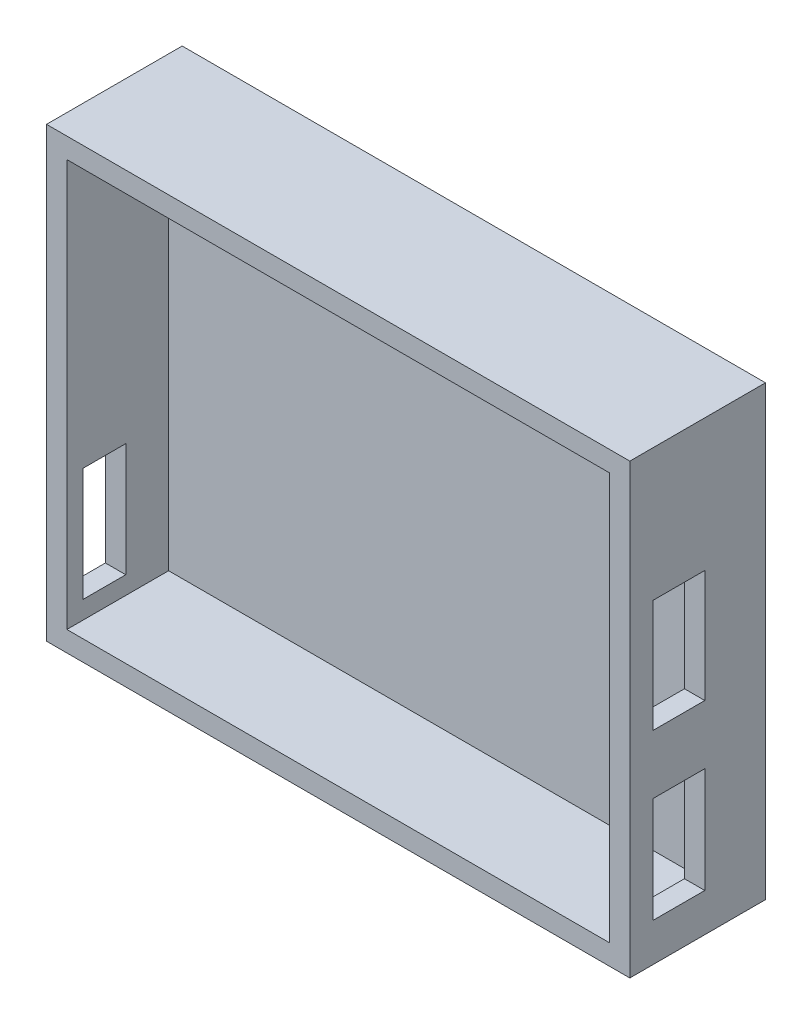
ISO-10303-21;
HEADER;
FILE_DESCRIPTION(('STEP AP214'),'2;1');
FILE_NAME('part.step','',(''),(''),'','','');
FILE_SCHEMA(('AUTOMOTIVE_DESIGN { 1 0 10303 214 1 1 1 1 }'));
ENDSEC;
DATA;
#1=APPLICATION_CONTEXT('core data for automotive mechanical design processes');
#2=APPLICATION_PROTOCOL_DEFINITION('international standard','automotive_design',2000,#1);
#3=PRODUCT_CONTEXT('',#1,'mechanical');
#4=PRODUCT('Part','Part','',(#3));
#5=PRODUCT_RELATED_PRODUCT_CATEGORY('part','',(#4));
#6=PRODUCT_DEFINITION_FORMATION('','',#4);
#7=PRODUCT_DEFINITION_CONTEXT('part definition',#1,'design');
#8=PRODUCT_DEFINITION('design','',#6,#7);
#9=PRODUCT_DEFINITION_SHAPE('','',#8);
#10=(LENGTH_UNIT() NAMED_UNIT(*) SI_UNIT(.MILLI.,.METRE.));
#11=(NAMED_UNIT(*) PLANE_ANGLE_UNIT() SI_UNIT($,.RADIAN.));
#12=(NAMED_UNIT(*) SI_UNIT($,.STERADIAN.) SOLID_ANGLE_UNIT());
#13=UNCERTAINTY_MEASURE_WITH_UNIT(LENGTH_MEASURE(1.E-05),#10,'distance_accuracy_value','');
#14=(GEOMETRIC_REPRESENTATION_CONTEXT(3) GLOBAL_UNCERTAINTY_ASSIGNED_CONTEXT((#13)) GLOBAL_UNIT_ASSIGNED_CONTEXT((#10,
#11,#12)) REPRESENTATION_CONTEXT('',''));
#15=CARTESIAN_POINT('',(0.,0.,0.));
#16=DIRECTION('',(0.,0.,1.));
#17=DIRECTION('',(1.,0.,0.));
#18=AXIS2_PLACEMENT_3D('',#15,#16,#17);
#19=CARTESIAN_POINT('',(-35.8301158301159,27.3359073359073,5.));
#20=DIRECTION('',(1.,0.,0.));
#21=DIRECTION('',(0.,1.,0.));
#22=AXIS2_PLACEMENT_3D('',#19,#20,#21);
#23=PLANE('',#22);
#24=DIRECTION('',(0.,0.,1.));
#25=VECTOR('',#24,1.);
#26=CARTESIAN_POINT('',(-35.8301158301158,-33.0147325704409,11.3181031280168));
#27=LINE('',#26,#25);
#28=CARTESIAN_POINT('',(-35.8301158301158,-33.0147325704409,11.3181031280168));
#29=VERTEX_POINT('',#28);
#30=CARTESIAN_POINT('',(-35.8301158301158,-33.0147325704409,17.6449981424974));
#31=VERTEX_POINT('',#30);
#32=EDGE_CURVE('E218',#29,#31,#27,.T.);
#33=ORIENTED_EDGE('',*,*,#32,.F.);
#34=DIRECTION('',(0.,-1.,0.));
#35=VECTOR('',#34,1.);
#36=CARTESIAN_POINT('',(-35.8301158301159,-16.2748228446276,11.3181031280168));
#37=LINE('',#36,#35);
#38=CARTESIAN_POINT('',(-35.8301158301159,-16.2748228446276,11.3181031280168));
#39=VERTEX_POINT('',#38);
#40=EDGE_CURVE('E210',#39,#29,#37,.T.);
#41=ORIENTED_EDGE('',*,*,#40,.F.);
#42=DIRECTION('',(0.,0.,-1.));
#43=VECTOR('',#42,1.);
#44=CARTESIAN_POINT('',(-35.8301158301159,-16.2748228446276,11.3181031280168));
#45=LINE('',#44,#43);
#46=CARTESIAN_POINT('',(-35.8301158301159,-16.2748228446276,17.6449981424974));
#47=VERTEX_POINT('',#46);
#48=EDGE_CURVE('E224',#47,#39,#45,.T.);
#49=ORIENTED_EDGE('',*,*,#48,.F.);
#50=DIRECTION('',(0.,1.,0.));
#51=VECTOR('',#50,1.);
#52=CARTESIAN_POINT('',(-35.8301158301159,-16.2748228446276,17.6449981424974));
#53=LINE('',#52,#51);
#54=EDGE_CURVE('E221',#31,#47,#53,.T.);
#55=ORIENTED_EDGE('',*,*,#54,.F.);
#56=EDGE_LOOP('',(#33,#41,#49,#55));
#57=FACE_BOUND('',#56,.T.);
#58=DIRECTION('',(0.,-1.,0.));
#59=VECTOR('',#58,1.);
#60=CARTESIAN_POINT('',(-35.8301158301159,27.3359073359073,0.));
#61=LINE('',#60,#59);
#62=CARTESIAN_POINT('',(-35.8301158301159,27.3359073359073,0.));
#63=VERTEX_POINT('',#62);
#64=CARTESIAN_POINT('',(-35.8301158301158,-38.6640926640927,0.));
#65=VERTEX_POINT('',#64);
#66=EDGE_CURVE('E277',#63,#65,#61,.T.);
#67=ORIENTED_EDGE('',*,*,#66,.T.);
#68=DIRECTION('',(0.,0.,-1.));
#69=VECTOR('',#68,1.);
#70=CARTESIAN_POINT('',(-35.8301158301158,-38.6640926640927,5.));
#71=LINE('',#70,#69);
#72=CARTESIAN_POINT('',(-35.8301158301159,-38.6640926640927,20.));
#73=VERTEX_POINT('',#72);
#74=EDGE_CURVE('E295',#73,#65,#71,.T.);
#75=ORIENTED_EDGE('',*,*,#74,.F.);
#76=DIRECTION('',(0.,-1.,0.));
#77=VECTOR('',#76,1.);
#78=CARTESIAN_POINT('',(-35.8301158301159,27.3359073359073,20.));
#79=LINE('',#78,#77);
#80=CARTESIAN_POINT('',(-35.8301158301159,27.3359073359073,20.));
#81=VERTEX_POINT('',#80);
#82=EDGE_CURVE('E265',#81,#73,#79,.T.);
#83=ORIENTED_EDGE('',*,*,#82,.F.);
#84=DIRECTION('',(0.,0.,-1.));
#85=VECTOR('',#84,1.);
#86=CARTESIAN_POINT('',(-35.8301158301159,27.3359073359073,5.));
#87=LINE('',#86,#85);
#88=EDGE_CURVE('E286',#81,#63,#87,.T.);
#89=ORIENTED_EDGE('',*,*,#88,.T.);
#90=EDGE_LOOP('',(#67,#75,#83,#89));
#91=FACE_BOUND('',#90,.T.);
#92=ADVANCED_FACE('F33',(#57,#91),#23,.F.);
#93=CARTESIAN_POINT('',(-35.8301158301158,-38.6640926640927,5.));
#94=DIRECTION('',(0.,1.,0.));
#95=DIRECTION('',(0.,0.,1.));
#96=AXIS2_PLACEMENT_3D('',#93,#94,#95);
#97=PLANE('',#96);
#98=DIRECTION('',(1.,0.,0.));
#99=VECTOR('',#98,1.);
#100=CARTESIAN_POINT('',(-35.8301158301158,-38.6640926640927,0.));
#101=LINE('',#100,#99);
#102=CARTESIAN_POINT('',(50.1698841698842,-38.6640926640927,0.));
#103=VERTEX_POINT('',#102);
#104=EDGE_CURVE('E280',#65,#103,#101,.T.);
#105=ORIENTED_EDGE('',*,*,#104,.T.);
#106=DIRECTION('',(0.,0.,-1.));
#107=VECTOR('',#106,1.);
#108=CARTESIAN_POINT('',(50.1698841698842,-38.6640926640927,5.));
#109=LINE('',#108,#107);
#110=CARTESIAN_POINT('',(50.1698841698842,-38.6640926640927,20.));
#111=VERTEX_POINT('',#110);
#112=EDGE_CURVE('E292',#111,#103,#109,.T.);
#113=ORIENTED_EDGE('',*,*,#112,.F.);
#114=DIRECTION('',(1.,0.,0.));
#115=VECTOR('',#114,1.);
#116=CARTESIAN_POINT('',(-35.8301158301159,-38.6640926640927,20.));
#117=LINE('',#116,#115);
#118=EDGE_CURVE('E268',#73,#111,#117,.T.);
#119=ORIENTED_EDGE('',*,*,#118,.F.);
#120=ORIENTED_EDGE('',*,*,#74,.T.);
#121=EDGE_LOOP('',(#105,#113,#119,#120));
#122=FACE_BOUND('',#121,.T.);
#123=ADVANCED_FACE('F341',(#122),#97,.F.);
#124=CARTESIAN_POINT('',(50.1698841698841,27.3359073359073,5.));
#125=DIRECTION('',(-1.,0.,0.));
#126=DIRECTION('',(0.,-1.,0.));
#127=AXIS2_PLACEMENT_3D('',#124,#125,#126);
#128=PLANE('',#127);
#129=DIRECTION('',(0.,0.,-1.));
#130=VECTOR('',#129,1.);
#131=CARTESIAN_POINT('',(50.1698841698841,-8.76163501493182,16.590515640084));
#132=LINE('',#131,#130);
#133=CARTESIAN_POINT('',(50.1698841698841,-8.76163501493182,16.590515640084));
#134=VERTEX_POINT('',#133);
#135=CARTESIAN_POINT('',(50.1698841698841,-8.76163501493182,8.94551749758656));
#136=VERTEX_POINT('',#135);
#137=EDGE_CURVE('E180',#134,#136,#132,.T.);
#138=ORIENTED_EDGE('',*,*,#137,.F.);
#139=DIRECTION('',(0.,-1.,0.));
#140=VECTOR('',#139,1.);
#141=CARTESIAN_POINT('',(50.1698841698841,7.84646439807983,16.590515640084));
#142=LINE('',#141,#140);
#143=CARTESIAN_POINT('',(50.1698841698841,7.84646439807983,16.590515640084));
#144=VERTEX_POINT('',#143);
#145=EDGE_CURVE('E47',#144,#134,#142,.T.);
#146=ORIENTED_EDGE('',*,*,#145,.F.);
#147=DIRECTION('',(0.,0.,1.));
#148=VECTOR('',#147,1.);
#149=CARTESIAN_POINT('',(50.1698841698841,7.84646439807983,16.590515640084));
#150=LINE('',#149,#148);
#151=CARTESIAN_POINT('',(50.1698841698841,7.84646439807983,8.94551749758656));
#152=VERTEX_POINT('',#151);
#153=EDGE_CURVE('E187',#152,#144,#150,.T.);
#154=ORIENTED_EDGE('',*,*,#153,.F.);
#155=DIRECTION('',(0.,1.,0.));
#156=VECTOR('',#155,1.);
#157=CARTESIAN_POINT('',(50.1698841698841,7.84646439807983,8.94551749758656));
#158=LINE('',#157,#156);
#159=EDGE_CURVE('E171',#136,#152,#158,.T.);
#160=ORIENTED_EDGE('',*,*,#159,.F.);
#161=EDGE_LOOP('',(#138,#146,#154,#160));
#162=FACE_BOUND('',#161,.T.);
#163=DIRECTION('',(0.,0.,-1.));
#164=VECTOR('',#163,1.);
#165=CARTESIAN_POINT('',(50.1698841698842,-33.0147325704409,16.590515640084));
#166=LINE('',#165,#164);
#167=CARTESIAN_POINT('',(50.1698841698842,-33.0147325704409,16.590515640084));
#168=VERTEX_POINT('',#167);
#169=CARTESIAN_POINT('',(50.1698841698842,-33.0147325704409,8.94551749758656));
#170=VERTEX_POINT('',#169);
#171=EDGE_CURVE('E198',#168,#170,#166,.T.);
#172=ORIENTED_EDGE('',*,*,#171,.F.);
#173=DIRECTION('',(0.,-1.,0.));
#174=VECTOR('',#173,1.);
#175=CARTESIAN_POINT('',(50.1698841698841,-17.4611156598427,16.590515640084));
#176=LINE('',#175,#174);
#177=CARTESIAN_POINT('',(50.1698841698841,-17.4611156598427,16.590515640084));
#178=VERTEX_POINT('',#177);
#179=EDGE_CURVE('E194',#178,#168,#176,.T.);
#180=ORIENTED_EDGE('',*,*,#179,.F.);
#181=DIRECTION('',(0.,0.,1.));
#182=VECTOR('',#181,1.);
#183=CARTESIAN_POINT('',(50.1698841698841,-17.4611156598427,16.590515640084));
#184=LINE('',#183,#182);
#185=CARTESIAN_POINT('',(50.1698841698841,-17.4611156598427,8.94551749758656));
#186=VERTEX_POINT('',#185);
#187=EDGE_CURVE('E204',#186,#178,#184,.T.);
#188=ORIENTED_EDGE('',*,*,#187,.F.);
#189=DIRECTION('',(0.,1.,0.));
#190=VECTOR('',#189,1.);
#191=CARTESIAN_POINT('',(50.1698841698841,-17.4611156598427,8.94551749758656));
#192=LINE('',#191,#190);
#193=EDGE_CURVE('E201',#170,#186,#192,.T.);
#194=ORIENTED_EDGE('',*,*,#193,.F.);
#195=EDGE_LOOP('',(#172,#180,#188,#194));
#196=FACE_BOUND('',#195,.T.);
#197=DIRECTION('',(0.,1.,0.));
#198=VECTOR('',#197,1.);
#199=CARTESIAN_POINT('',(50.1698841698841,27.3359073359073,0.));
#200=LINE('',#199,#198);
#201=CARTESIAN_POINT('',(50.1698841698841,27.3359073359073,0.));
#202=VERTEX_POINT('',#201);
#203=EDGE_CURVE('E282',#103,#202,#200,.T.);
#204=ORIENTED_EDGE('',*,*,#203,.T.);
#205=DIRECTION('',(0.,0.,-1.));
#206=VECTOR('',#205,1.);
#207=CARTESIAN_POINT('',(50.1698841698841,27.3359073359073,5.));
#208=LINE('',#207,#206);
#209=CARTESIAN_POINT('',(50.1698841698841,27.3359073359073,20.));
#210=VERTEX_POINT('',#209);
#211=EDGE_CURVE('E289',#210,#202,#208,.T.);
#212=ORIENTED_EDGE('',*,*,#211,.F.);
#213=DIRECTION('',(0.,1.,0.));
#214=VECTOR('',#213,1.);
#215=CARTESIAN_POINT('',(50.1698841698841,27.3359073359073,20.));
#216=LINE('',#215,#214);
#217=EDGE_CURVE('E271',#111,#210,#216,.T.);
#218=ORIENTED_EDGE('',*,*,#217,.F.);
#219=ORIENTED_EDGE('',*,*,#112,.T.);
#220=EDGE_LOOP('',(#204,#212,#218,#219));
#221=FACE_BOUND('',#220,.T.);
#222=ADVANCED_FACE('F184',(#162,#196,#221),#128,.F.);
#223=CARTESIAN_POINT('',(-35.8301158301159,27.3359073359073,5.));
#224=DIRECTION('',(0.,-1.,0.));
#225=DIRECTION('',(0.,0.,-1.));
#226=AXIS2_PLACEMENT_3D('',#223,#224,#225);
#227=PLANE('',#226);
#228=DIRECTION('',(-1.,0.,0.));
#229=VECTOR('',#228,1.);
#230=CARTESIAN_POINT('',(-35.8301158301159,27.3359073359073,0.));
#231=LINE('',#230,#229);
#232=EDGE_CURVE('E284',#202,#63,#231,.T.);
#233=ORIENTED_EDGE('',*,*,#232,.T.);
#234=ORIENTED_EDGE('',*,*,#88,.F.);
#235=DIRECTION('',(-1.,0.,0.));
#236=VECTOR('',#235,1.);
#237=CARTESIAN_POINT('',(-35.8301158301159,27.3359073359073,20.));
#238=LINE('',#237,#236);
#239=EDGE_CURVE('E274',#210,#81,#238,.T.);
#240=ORIENTED_EDGE('',*,*,#239,.F.);
#241=ORIENTED_EDGE('',*,*,#211,.T.);
#242=EDGE_LOOP('',(#233,#234,#240,#241));
#243=FACE_BOUND('',#242,.T.);
#244=ADVANCED_FACE('F364',(#243),#227,.F.);
#245=CARTESIAN_POINT('',(0.,0.,0.));
#246=DIRECTION('',(0.,0.,1.));
#247=DIRECTION('',(1.,0.,0.));
#248=AXIS2_PLACEMENT_3D('',#245,#246,#247);
#249=PLANE('',#248);
#250=ORIENTED_EDGE('',*,*,#66,.F.);
#251=ORIENTED_EDGE('',*,*,#232,.F.);
#252=ORIENTED_EDGE('',*,*,#203,.F.);
#253=ORIENTED_EDGE('',*,*,#104,.F.);
#254=EDGE_LOOP('',(#250,#251,#252,#253));
#255=FACE_BOUND('',#254,.T.);
#256=ADVANCED_FACE('F356',(#255),#249,.F.);
#257=CARTESIAN_POINT('',(0.,0.,20.));
#258=DIRECTION('',(0.,0.,1.));
#259=DIRECTION('',(1.,0.,0.));
#260=AXIS2_PLACEMENT_3D('',#257,#258,#259);
#261=PLANE('',#260);
#262=ORIENTED_EDGE('',*,*,#82,.T.);
#263=ORIENTED_EDGE('',*,*,#118,.T.);
#264=ORIENTED_EDGE('',*,*,#217,.T.);
#265=ORIENTED_EDGE('',*,*,#239,.T.);
#266=EDGE_LOOP('',(#262,#263,#264,#265));
#267=FACE_BOUND('',#266,.T.);
#268=DIRECTION('',(1.,0.,0.));
#269=VECTOR('',#268,1.);
#270=CARTESIAN_POINT('',(-32.8301158301159,-35.6640926640927,20.));
#271=LINE('',#270,#269);
#272=CARTESIAN_POINT('',(-32.8301158301159,-35.6640926640927,20.));
#273=VERTEX_POINT('',#272);
#274=CARTESIAN_POINT('',(47.1698841698841,-35.6640926640927,20.));
#275=VERTEX_POINT('',#274);
#276=EDGE_CURVE('E239',#273,#275,#271,.T.);
#277=ORIENTED_EDGE('',*,*,#276,.F.);
#278=DIRECTION('',(0.,-1.,0.));
#279=VECTOR('',#278,1.);
#280=CARTESIAN_POINT('',(-32.8301158301159,24.3359073359073,20.));
#281=LINE('',#280,#279);
#282=CARTESIAN_POINT('',(-32.8301158301159,24.3359073359073,20.));
#283=VERTEX_POINT('',#282);
#284=EDGE_CURVE('E237',#283,#273,#281,.T.);
#285=ORIENTED_EDGE('',*,*,#284,.F.);
#286=DIRECTION('',(-1.,0.,0.));
#287=VECTOR('',#286,1.);
#288=CARTESIAN_POINT('',(-32.8301158301159,24.3359073359073,20.));
#289=LINE('',#288,#287);
#290=CARTESIAN_POINT('',(47.1698841698841,24.3359073359073,20.));
#291=VERTEX_POINT('',#290);
#292=EDGE_CURVE('E245',#291,#283,#289,.T.);
#293=ORIENTED_EDGE('',*,*,#292,.F.);
#294=DIRECTION('',(0.,1.,0.));
#295=VECTOR('',#294,1.);
#296=CARTESIAN_POINT('',(47.1698841698841,24.3359073359073,20.));
#297=LINE('',#296,#295);
#298=EDGE_CURVE('E242',#275,#291,#297,.T.);
#299=ORIENTED_EDGE('',*,*,#298,.F.);
#300=EDGE_LOOP('',(#277,#285,#293,#299));
#301=FACE_BOUND('',#300,.T.);
#302=ADVANCED_FACE('F360',(#267,#301),#261,.T.);
#303=CARTESIAN_POINT('',(-32.8301158301159,24.3359073359073,20.));
#304=DIRECTION('',(1.,0.,0.));
#305=DIRECTION('',(0.,1.,0.));
#306=AXIS2_PLACEMENT_3D('',#303,#304,#305);
#307=PLANE('',#306);
#308=DIRECTION('',(0.,1.,0.));
#309=VECTOR('',#308,1.);
#310=CARTESIAN_POINT('',(-32.8301158301159,24.3359073359073,11.3181031280168));
#311=LINE('',#310,#309);
#312=CARTESIAN_POINT('',(-32.8301158301159,-33.0147325704409,11.3181031280168));
#313=VERTEX_POINT('',#312);
#314=CARTESIAN_POINT('',(-32.8301158301159,-16.2748228446276,11.3181031280168));
#315=VERTEX_POINT('',#314);
#316=EDGE_CURVE('E305',#313,#315,#311,.T.);
#317=ORIENTED_EDGE('',*,*,#316,.F.);
#318=DIRECTION('',(0.,0.,-1.));
#319=VECTOR('',#318,1.);
#320=CARTESIAN_POINT('',(-32.8301158301159,-33.0147325704409,20.));
#321=LINE('',#320,#319);
#322=CARTESIAN_POINT('',(-32.8301158301159,-33.0147325704409,17.6449981424974));
#323=VERTEX_POINT('',#322);
#324=EDGE_CURVE('E298',#323,#313,#321,.T.);
#325=ORIENTED_EDGE('',*,*,#324,.F.);
#326=DIRECTION('',(0.,-1.,0.));
#327=VECTOR('',#326,1.);
#328=CARTESIAN_POINT('',(-32.8301158301159,24.3359073359073,17.6449981424974));
#329=LINE('',#328,#327);
#330=CARTESIAN_POINT('',(-32.8301158301159,-16.2748228446276,17.6449981424974));
#331=VERTEX_POINT('',#330);
#332=EDGE_CURVE('E300',#331,#323,#329,.T.);
#333=ORIENTED_EDGE('',*,*,#332,.F.);
#334=DIRECTION('',(0.,0.,1.));
#335=VECTOR('',#334,1.);
#336=CARTESIAN_POINT('',(-32.8301158301159,-16.2748228446276,20.));
#337=LINE('',#336,#335);
#338=EDGE_CURVE('E303',#315,#331,#337,.T.);
#339=ORIENTED_EDGE('',*,*,#338,.F.);
#340=EDGE_LOOP('',(#317,#325,#333,#339));
#341=FACE_BOUND('',#340,.T.);
#342=DIRECTION('',(0.,-1.,0.));
#343=VECTOR('',#342,1.);
#344=CARTESIAN_POINT('',(-32.8301158301159,24.3359073359073,5.));
#345=LINE('',#344,#343);
#346=CARTESIAN_POINT('',(-32.8301158301159,24.3359073359073,5.));
#347=VERTEX_POINT('',#346);
#348=CARTESIAN_POINT('',(-32.8301158301159,-35.6640926640927,5.));
#349=VERTEX_POINT('',#348);
#350=EDGE_CURVE('E230',#347,#349,#345,.T.);
#351=ORIENTED_EDGE('',*,*,#350,.F.);
#352=DIRECTION('',(0.,0.,-1.));
#353=VECTOR('',#352,1.);
#354=CARTESIAN_POINT('',(-32.8301158301159,24.3359073359073,20.));
#355=LINE('',#354,#353);
#356=EDGE_CURVE('E247',#283,#347,#355,.T.);
#357=ORIENTED_EDGE('',*,*,#356,.F.);
#358=ORIENTED_EDGE('',*,*,#284,.T.);
#359=DIRECTION('',(0.,0.,-1.));
#360=VECTOR('',#359,1.);
#361=CARTESIAN_POINT('',(-32.8301158301159,-35.6640926640927,20.));
#362=LINE('',#361,#360);
#363=EDGE_CURVE('E262',#273,#349,#362,.T.);
#364=ORIENTED_EDGE('',*,*,#363,.T.);
#365=EDGE_LOOP('',(#351,#357,#358,#364));
#366=FACE_BOUND('',#365,.T.);
#367=ADVANCED_FACE('F383',(#341,#366),#307,.T.);
#368=CARTESIAN_POINT('',(-32.8301158301159,-35.6640926640927,20.));
#369=DIRECTION('',(0.,1.,0.));
#370=DIRECTION('',(0.,0.,1.));
#371=AXIS2_PLACEMENT_3D('',#368,#369,#370);
#372=PLANE('',#371);
#373=DIRECTION('',(1.,0.,0.));
#374=VECTOR('',#373,1.);
#375=CARTESIAN_POINT('',(-32.8301158301159,-35.6640926640927,5.));
#376=LINE('',#375,#374);
#377=CARTESIAN_POINT('',(47.1698841698841,-35.6640926640927,5.));
#378=VERTEX_POINT('',#377);
#379=EDGE_CURVE('E249',#349,#378,#376,.T.);
#380=ORIENTED_EDGE('',*,*,#379,.F.);
#381=ORIENTED_EDGE('',*,*,#363,.F.);
#382=ORIENTED_EDGE('',*,*,#276,.T.);
#383=DIRECTION('',(0.,0.,-1.));
#384=VECTOR('',#383,1.);
#385=CARTESIAN_POINT('',(47.1698841698841,-35.6640926640927,20.));
#386=LINE('',#385,#384);
#387=EDGE_CURVE('E259',#275,#378,#386,.T.);
#388=ORIENTED_EDGE('',*,*,#387,.T.);
#389=EDGE_LOOP('',(#380,#381,#382,#388));
#390=FACE_BOUND('',#389,.T.);
#391=ADVANCED_FACE('F386',(#390),#372,.T.);
#392=CARTESIAN_POINT('',(47.1698841698841,24.3359073359073,20.));
#393=DIRECTION('',(-1.,0.,0.));
#394=DIRECTION('',(0.,-1.,0.));
#395=AXIS2_PLACEMENT_3D('',#392,#393,#394);
#396=PLANE('',#395);
#397=DIRECTION('',(0.,1.,0.));
#398=VECTOR('',#397,1.);
#399=CARTESIAN_POINT('',(47.1698841698841,24.3359073359073,16.590515640084));
#400=LINE('',#399,#398);
#401=CARTESIAN_POINT('',(47.1698841698841,-8.76163501493182,16.590515640084));
#402=VERTEX_POINT('',#401);
#403=CARTESIAN_POINT('',(47.1698841698841,7.84646439807982,16.590515640084));
#404=VERTEX_POINT('',#403);
#405=EDGE_CURVE('E11',#402,#404,#400,.T.);
#406=ORIENTED_EDGE('',*,*,#405,.F.);
#407=DIRECTION('',(0.,0.,1.));
#408=VECTOR('',#407,1.);
#409=CARTESIAN_POINT('',(47.1698841698841,-8.76163501493182,20.));
#410=LINE('',#409,#408);
#411=CARTESIAN_POINT('',(47.1698841698841,-8.76163501493182,8.94551749758656));
#412=VERTEX_POINT('',#411);
#413=EDGE_CURVE('E316',#412,#402,#410,.T.);
#414=ORIENTED_EDGE('',*,*,#413,.F.);
#415=DIRECTION('',(0.,-1.,0.));
#416=VECTOR('',#415,1.);
#417=CARTESIAN_POINT('',(47.1698841698841,24.3359073359073,8.94551749758656));
#418=LINE('',#417,#416);
#419=CARTESIAN_POINT('',(47.1698841698841,7.84646439807982,8.94551749758656));
#420=VERTEX_POINT('',#419);
#421=EDGE_CURVE('E174',#420,#412,#418,.T.);
#422=ORIENTED_EDGE('',*,*,#421,.F.);
#423=DIRECTION('',(0.,0.,-1.));
#424=VECTOR('',#423,1.);
#425=CARTESIAN_POINT('',(47.1698841698841,7.84646439807982,20.));
#426=LINE('',#425,#424);
#427=EDGE_CURVE('E40',#404,#420,#426,.T.);
#428=ORIENTED_EDGE('',*,*,#427,.F.);
#429=EDGE_LOOP('',(#406,#414,#422,#428));
#430=FACE_BOUND('',#429,.T.);
#431=DIRECTION('',(0.,1.,0.));
#432=VECTOR('',#431,1.);
#433=CARTESIAN_POINT('',(47.1698841698841,24.3359073359073,16.590515640084));
#434=LINE('',#433,#432);
#435=CARTESIAN_POINT('',(47.1698841698841,-33.0147325704409,16.590515640084));
#436=VERTEX_POINT('',#435);
#437=CARTESIAN_POINT('',(47.1698841698841,-17.4611156598427,16.590515640084));
#438=VERTEX_POINT('',#437);
#439=EDGE_CURVE('E314',#436,#438,#434,.T.);
#440=ORIENTED_EDGE('',*,*,#439,.F.);
#441=DIRECTION('',(0.,0.,1.));
#442=VECTOR('',#441,1.);
#443=CARTESIAN_POINT('',(47.1698841698841,-33.0147325704409,20.));
#444=LINE('',#443,#442);
#445=CARTESIAN_POINT('',(47.1698841698841,-33.0147325704409,8.94551749758656));
#446=VERTEX_POINT('',#445);
#447=EDGE_CURVE('E307',#446,#436,#444,.T.);
#448=ORIENTED_EDGE('',*,*,#447,.F.);
#449=DIRECTION('',(0.,-1.,0.));
#450=VECTOR('',#449,1.);
#451=CARTESIAN_POINT('',(47.1698841698841,24.3359073359073,8.94551749758656));
#452=LINE('',#451,#450);
#453=CARTESIAN_POINT('',(47.1698841698841,-17.4611156598427,8.94551749758656));
#454=VERTEX_POINT('',#453);
#455=EDGE_CURVE('E309',#454,#446,#452,.T.);
#456=ORIENTED_EDGE('',*,*,#455,.F.);
#457=DIRECTION('',(0.,0.,-1.));
#458=VECTOR('',#457,1.);
#459=CARTESIAN_POINT('',(47.1698841698841,-17.4611156598427,20.));
#460=LINE('',#459,#458);
#461=EDGE_CURVE('E312',#438,#454,#460,.T.);
#462=ORIENTED_EDGE('',*,*,#461,.F.);
#463=EDGE_LOOP('',(#440,#448,#456,#462));
#464=FACE_BOUND('',#463,.T.);
#465=DIRECTION('',(0.,1.,0.));
#466=VECTOR('',#465,1.);
#467=CARTESIAN_POINT('',(47.1698841698841,24.3359073359073,5.));
#468=LINE('',#467,#466);
#469=CARTESIAN_POINT('',(47.1698841698841,24.3359073359073,5.));
#470=VERTEX_POINT('',#469);
#471=EDGE_CURVE('E251',#378,#470,#468,.T.);
#472=ORIENTED_EDGE('',*,*,#471,.F.);
#473=ORIENTED_EDGE('',*,*,#387,.F.);
#474=ORIENTED_EDGE('',*,*,#298,.T.);
#475=DIRECTION('',(0.,0.,-1.));
#476=VECTOR('',#475,1.);
#477=CARTESIAN_POINT('',(47.1698841698841,24.3359073359073,20.));
#478=LINE('',#477,#476);
#479=EDGE_CURVE('E256',#291,#470,#478,.T.);
#480=ORIENTED_EDGE('',*,*,#479,.T.);
#481=EDGE_LOOP('',(#472,#473,#474,#480));
#482=FACE_BOUND('',#481,.T.);
#483=ADVANCED_FACE('F324',(#430,#464,#482),#396,.T.);
#484=CARTESIAN_POINT('',(-32.8301158301159,24.3359073359073,20.));
#485=DIRECTION('',(0.,-1.,0.));
#486=DIRECTION('',(1.,0.,0.));
#487=AXIS2_PLACEMENT_3D('',#484,#485,#486);
#488=PLANE('',#487);
#489=DIRECTION('',(-1.,0.,0.));
#490=VECTOR('',#489,1.);
#491=CARTESIAN_POINT('',(-32.8301158301159,24.3359073359073,5.));
#492=LINE('',#491,#490);
#493=EDGE_CURVE('E240',#470,#347,#492,.T.);
#494=ORIENTED_EDGE('',*,*,#493,.F.);
#495=ORIENTED_EDGE('',*,*,#479,.F.);
#496=ORIENTED_EDGE('',*,*,#292,.T.);
#497=ORIENTED_EDGE('',*,*,#356,.T.);
#498=EDGE_LOOP('',(#494,#495,#496,#497));
#499=FACE_BOUND('',#498,.T.);
#500=ADVANCED_FACE('F379',(#499),#488,.T.);
#501=CARTESIAN_POINT('',(0.,0.,5.));
#502=DIRECTION('',(0.,0.,1.));
#503=DIRECTION('',(1.,0.,0.));
#504=AXIS2_PLACEMENT_3D('',#501,#502,#503);
#505=PLANE('',#504);
#506=ORIENTED_EDGE('',*,*,#350,.T.);
#507=ORIENTED_EDGE('',*,*,#379,.T.);
#508=ORIENTED_EDGE('',*,*,#471,.T.);
#509=ORIENTED_EDGE('',*,*,#493,.T.);
#510=EDGE_LOOP('',(#506,#507,#508,#509));
#511=FACE_BOUND('',#510,.T.);
#512=ADVANCED_FACE('F375',(#511),#505,.T.);
#513=CARTESIAN_POINT('',(-20.8301158301159,-16.2748228446276,11.3181031280168));
#514=DIRECTION('',(0.,0.,-1.));
#515=DIRECTION('',(-1.,0.,0.));
#516=AXIS2_PLACEMENT_3D('',#513,#514,#515);
#517=PLANE('',#516);
#518=ORIENTED_EDGE('',*,*,#316,.T.);
#519=DIRECTION('',(-1.,0.,0.));
#520=VECTOR('',#519,1.);
#521=CARTESIAN_POINT('',(-20.8301158301159,-16.2748228446276,11.3181031280168));
#522=LINE('',#521,#520);
#523=EDGE_CURVE('E228',#315,#39,#522,.T.);
#524=ORIENTED_EDGE('',*,*,#523,.T.);
#525=ORIENTED_EDGE('',*,*,#40,.T.);
#526=DIRECTION('',(-1.,0.,0.));
#527=VECTOR('',#526,1.);
#528=CARTESIAN_POINT('',(-20.8301158301158,-33.0147325704409,11.3181031280168));
#529=LINE('',#528,#527);
#530=EDGE_CURVE('E227',#313,#29,#529,.T.);
#531=ORIENTED_EDGE('',*,*,#530,.F.);
#532=EDGE_LOOP('',(#518,#524,#525,#531));
#533=FACE_BOUND('',#532,.T.);
#534=ADVANCED_FACE('F378',(#533),#517,.F.);
#535=CARTESIAN_POINT('',(-20.8301158301159,-16.2748228446276,11.3181031280168));
#536=DIRECTION('',(0.,1.,0.));
#537=DIRECTION('',(-1.,0.,0.));
#538=AXIS2_PLACEMENT_3D('',#535,#536,#537);
#539=PLANE('',#538);
#540=ORIENTED_EDGE('',*,*,#338,.T.);
#541=DIRECTION('',(-1.,0.,0.));
#542=VECTOR('',#541,1.);
#543=CARTESIAN_POINT('',(-20.8301158301159,-16.2748228446276,17.6449981424974));
#544=LINE('',#543,#542);
#545=EDGE_CURVE('E231',#331,#47,#544,.T.);
#546=ORIENTED_EDGE('',*,*,#545,.T.);
#547=ORIENTED_EDGE('',*,*,#48,.T.);
#548=ORIENTED_EDGE('',*,*,#523,.F.);
#549=EDGE_LOOP('',(#540,#546,#547,#548));
#550=FACE_BOUND('',#549,.T.);
#551=ADVANCED_FACE('F398',(#550),#539,.F.);
#552=CARTESIAN_POINT('',(-20.8301158301159,-16.2748228446276,17.6449981424974));
#553=DIRECTION('',(0.,0.,1.));
#554=DIRECTION('',(1.,0.,0.));
#555=AXIS2_PLACEMENT_3D('',#552,#553,#554);
#556=PLANE('',#555);
#557=ORIENTED_EDGE('',*,*,#332,.T.);
#558=DIRECTION('',(-1.,0.,0.));
#559=VECTOR('',#558,1.);
#560=CARTESIAN_POINT('',(-20.8301158301158,-33.0147325704409,17.6449981424974));
#561=LINE('',#560,#559);
#562=EDGE_CURVE('E233',#323,#31,#561,.T.);
#563=ORIENTED_EDGE('',*,*,#562,.T.);
#564=ORIENTED_EDGE('',*,*,#54,.T.);
#565=ORIENTED_EDGE('',*,*,#545,.F.);
#566=EDGE_LOOP('',(#557,#563,#564,#565));
#567=FACE_BOUND('',#566,.T.);
#568=ADVANCED_FACE('F404',(#567),#556,.F.);
#569=CARTESIAN_POINT('',(-20.8301158301158,-33.0147325704409,11.3181031280168));
#570=DIRECTION('',(0.,-1.,0.));
#571=DIRECTION('',(1.,0.,0.));
#572=AXIS2_PLACEMENT_3D('',#569,#570,#571);
#573=PLANE('',#572);
#574=ORIENTED_EDGE('',*,*,#324,.T.);
#575=ORIENTED_EDGE('',*,*,#530,.T.);
#576=ORIENTED_EDGE('',*,*,#32,.T.);
#577=ORIENTED_EDGE('',*,*,#562,.F.);
#578=EDGE_LOOP('',(#574,#575,#576,#577));
#579=FACE_BOUND('',#578,.T.);
#580=ADVANCED_FACE('F400',(#579),#573,.F.);
#581=CARTESIAN_POINT('',(35.1698841698841,-17.4611156598427,16.590515640084));
#582=DIRECTION('',(0.,0.,1.));
#583=DIRECTION('',(1.,0.,0.));
#584=AXIS2_PLACEMENT_3D('',#581,#582,#583);
#585=PLANE('',#584);
#586=ORIENTED_EDGE('',*,*,#439,.T.);
#587=DIRECTION('',(1.,0.,0.));
#588=VECTOR('',#587,1.);
#589=CARTESIAN_POINT('',(35.1698841698841,-17.4611156598427,16.590515640084));
#590=LINE('',#589,#588);
#591=EDGE_CURVE('E208',#438,#178,#590,.T.);
#592=ORIENTED_EDGE('',*,*,#591,.T.);
#593=ORIENTED_EDGE('',*,*,#179,.T.);
#594=DIRECTION('',(1.,0.,0.));
#595=VECTOR('',#594,1.);
#596=CARTESIAN_POINT('',(35.1698841698842,-33.0147325704409,16.590515640084));
#597=LINE('',#596,#595);
#598=EDGE_CURVE('E207',#436,#168,#597,.T.);
#599=ORIENTED_EDGE('',*,*,#598,.F.);
#600=EDGE_LOOP('',(#586,#592,#593,#599));
#601=FACE_BOUND('',#600,.T.);
#602=ADVANCED_FACE('F403',(#601),#585,.F.);
#603=CARTESIAN_POINT('',(35.1698841698841,-17.4611156598427,16.590515640084));
#604=DIRECTION('',(0.,1.,0.));
#605=DIRECTION('',(-1.,0.,0.));
#606=AXIS2_PLACEMENT_3D('',#603,#604,#605);
#607=PLANE('',#606);
#608=ORIENTED_EDGE('',*,*,#461,.T.);
#609=DIRECTION('',(1.,0.,0.));
#610=VECTOR('',#609,1.);
#611=CARTESIAN_POINT('',(35.1698841698841,-17.4611156598427,8.94551749758656));
#612=LINE('',#611,#610);
#613=EDGE_CURVE('E211',#454,#186,#612,.T.);
#614=ORIENTED_EDGE('',*,*,#613,.T.);
#615=ORIENTED_EDGE('',*,*,#187,.T.);
#616=ORIENTED_EDGE('',*,*,#591,.F.);
#617=EDGE_LOOP('',(#608,#614,#615,#616));
#618=FACE_BOUND('',#617,.T.);
#619=ADVANCED_FACE('F413',(#618),#607,.F.);
#620=CARTESIAN_POINT('',(35.1698841698841,-17.4611156598427,8.94551749758656));
#621=DIRECTION('',(0.,0.,-1.));
#622=DIRECTION('',(-1.,0.,0.));
#623=AXIS2_PLACEMENT_3D('',#620,#621,#622);
#624=PLANE('',#623);
#625=ORIENTED_EDGE('',*,*,#455,.T.);
#626=DIRECTION('',(1.,0.,0.));
#627=VECTOR('',#626,1.);
#628=CARTESIAN_POINT('',(35.1698841698842,-33.0147325704409,8.94551749758656));
#629=LINE('',#628,#627);
#630=EDGE_CURVE('E213',#446,#170,#629,.T.);
#631=ORIENTED_EDGE('',*,*,#630,.T.);
#632=ORIENTED_EDGE('',*,*,#193,.T.);
#633=ORIENTED_EDGE('',*,*,#613,.F.);
#634=EDGE_LOOP('',(#625,#631,#632,#633));
#635=FACE_BOUND('',#634,.T.);
#636=ADVANCED_FACE('F335',(#635),#624,.F.);
#637=CARTESIAN_POINT('',(35.1698841698842,-33.0147325704409,16.590515640084));
#638=DIRECTION('',(0.,-1.,0.));
#639=DIRECTION('',(1.,0.,0.));
#640=AXIS2_PLACEMENT_3D('',#637,#638,#639);
#641=PLANE('',#640);
#642=ORIENTED_EDGE('',*,*,#447,.T.);
#643=ORIENTED_EDGE('',*,*,#598,.T.);
#644=ORIENTED_EDGE('',*,*,#171,.T.);
#645=ORIENTED_EDGE('',*,*,#630,.F.);
#646=EDGE_LOOP('',(#642,#643,#644,#645));
#647=FACE_BOUND('',#646,.T.);
#648=ADVANCED_FACE('F328',(#647),#641,.F.);
#649=CARTESIAN_POINT('',(35.1698841698841,7.84646439807982,16.590515640084));
#650=DIRECTION('',(0.,0.,1.));
#651=DIRECTION('',(1.,0.,0.));
#652=AXIS2_PLACEMENT_3D('',#649,#650,#651);
#653=PLANE('',#652);
#654=ORIENTED_EDGE('',*,*,#405,.T.);
#655=DIRECTION('',(1.,0.,0.));
#656=VECTOR('',#655,1.);
#657=CARTESIAN_POINT('',(35.1698841698841,7.84646439807982,16.590515640084));
#658=LINE('',#657,#656);
#659=EDGE_CURVE('E192',#404,#144,#658,.T.);
#660=ORIENTED_EDGE('',*,*,#659,.T.);
#661=ORIENTED_EDGE('',*,*,#145,.T.);
#662=DIRECTION('',(1.,0.,0.));
#663=VECTOR('',#662,1.);
#664=CARTESIAN_POINT('',(35.1698841698841,-8.76163501493183,16.590515640084));
#665=LINE('',#664,#663);
#666=EDGE_CURVE('E177',#402,#134,#665,.T.);
#667=ORIENTED_EDGE('',*,*,#666,.F.);
#668=EDGE_LOOP('',(#654,#660,#661,#667));
#669=FACE_BOUND('',#668,.T.);
#670=ADVANCED_FACE('F326',(#669),#653,.F.);
#671=CARTESIAN_POINT('',(35.1698841698841,7.84646439807982,16.590515640084));
#672=DIRECTION('',(0.,1.,0.));
#673=DIRECTION('',(-1.,0.,0.));
#674=AXIS2_PLACEMENT_3D('',#671,#672,#673);
#675=PLANE('',#674);
#676=ORIENTED_EDGE('',*,*,#427,.T.);
#677=DIRECTION('',(1.,0.,0.));
#678=VECTOR('',#677,1.);
#679=CARTESIAN_POINT('',(35.1698841698841,7.84646439807982,8.94551749758656));
#680=LINE('',#679,#678);
#681=EDGE_CURVE('E176',#420,#152,#680,.T.);
#682=ORIENTED_EDGE('',*,*,#681,.T.);
#683=ORIENTED_EDGE('',*,*,#153,.T.);
#684=ORIENTED_EDGE('',*,*,#659,.F.);
#685=EDGE_LOOP('',(#676,#682,#683,#684));
#686=FACE_BOUND('',#685,.T.);
#687=ADVANCED_FACE('F321',(#686),#675,.F.);
#688=CARTESIAN_POINT('',(35.1698841698841,7.84646439807982,8.94551749758656));
#689=DIRECTION('',(0.,0.,-1.));
#690=DIRECTION('',(-1.,0.,0.));
#691=AXIS2_PLACEMENT_3D('',#688,#689,#690);
#692=PLANE('',#691);
#693=ORIENTED_EDGE('',*,*,#421,.T.);
#694=DIRECTION('',(1.,0.,0.));
#695=VECTOR('',#694,1.);
#696=CARTESIAN_POINT('',(35.1698841698841,-8.76163501493183,8.94551749758656));
#697=LINE('',#696,#695);
#698=EDGE_CURVE('E55',#412,#136,#697,.T.);
#699=ORIENTED_EDGE('',*,*,#698,.T.);
#700=ORIENTED_EDGE('',*,*,#159,.T.);
#701=ORIENTED_EDGE('',*,*,#681,.F.);
#702=EDGE_LOOP('',(#693,#699,#700,#701));
#703=FACE_BOUND('',#702,.T.);
#704=ADVANCED_FACE('F168',(#703),#692,.F.);
#705=CARTESIAN_POINT('',(35.1698841698841,-8.76163501493183,16.590515640084));
#706=DIRECTION('',(0.,-1.,0.));
#707=DIRECTION('',(1.,0.,0.));
#708=AXIS2_PLACEMENT_3D('',#705,#706,#707);
#709=PLANE('',#708);
#710=ORIENTED_EDGE('',*,*,#413,.T.);
#711=ORIENTED_EDGE('',*,*,#666,.T.);
#712=ORIENTED_EDGE('',*,*,#137,.T.);
#713=ORIENTED_EDGE('',*,*,#698,.F.);
#714=EDGE_LOOP('',(#710,#711,#712,#713));
#715=FACE_BOUND('',#714,.T.);
#716=ADVANCED_FACE('F181',(#715),#709,.F.);
#717=CLOSED_SHELL('',(#92,#123,#222,#244,#256,#302,#367,#391,#483,#500,#512,#534,#551,#568,#580,
#602,#619,#636,#648,#670,#687,#704,#716));
#718=MANIFOLD_SOLID_BREP('B2',#717);
#719=ADVANCED_BREP_SHAPE_REPRESENTATION('',(#18,#718),#14);
#720=SHAPE_DEFINITION_REPRESENTATION(#9,#719);
ENDSEC;
END-ISO-10303-21;
